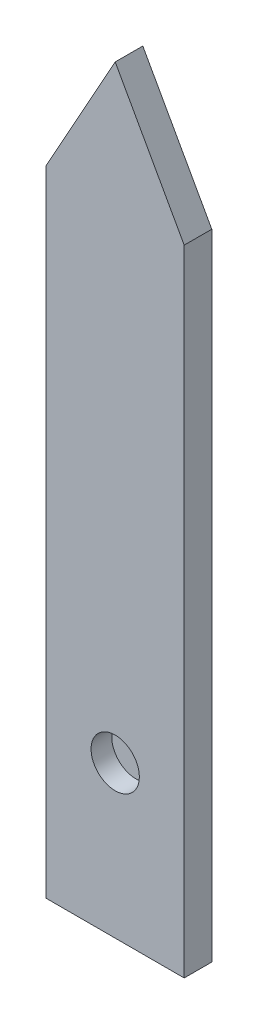
ISO-10303-21;
HEADER;
FILE_DESCRIPTION(('STEP AP214'),'2;1');
FILE_NAME('part.step','',(''),(''),'','','');
FILE_SCHEMA(('AUTOMOTIVE_DESIGN { 1 0 10303 214 1 1 1 1 }'));
ENDSEC;
DATA;
#1=APPLICATION_CONTEXT('core data for automotive mechanical design processes');
#2=APPLICATION_PROTOCOL_DEFINITION('international standard','automotive_design',2000,#1);
#3=PRODUCT_CONTEXT('',#1,'mechanical');
#4=PRODUCT('Part','Part','',(#3));
#5=PRODUCT_RELATED_PRODUCT_CATEGORY('part','',(#4));
#6=PRODUCT_DEFINITION_FORMATION('','',#4);
#7=PRODUCT_DEFINITION_CONTEXT('part definition',#1,'design');
#8=PRODUCT_DEFINITION('design','',#6,#7);
#9=PRODUCT_DEFINITION_SHAPE('','',#8);
#10=(LENGTH_UNIT() NAMED_UNIT(*) SI_UNIT(.MILLI.,.METRE.));
#11=(NAMED_UNIT(*) PLANE_ANGLE_UNIT() SI_UNIT($,.RADIAN.));
#12=(NAMED_UNIT(*) SI_UNIT($,.STERADIAN.) SOLID_ANGLE_UNIT());
#13=UNCERTAINTY_MEASURE_WITH_UNIT(LENGTH_MEASURE(1.E-05),#10,'distance_accuracy_value','');
#14=(GEOMETRIC_REPRESENTATION_CONTEXT(3) GLOBAL_UNCERTAINTY_ASSIGNED_CONTEXT((#13)) GLOBAL_UNIT_ASSIGNED_CONTEXT((#10,
#11,#12)) REPRESENTATION_CONTEXT('',''));
#15=CARTESIAN_POINT('',(0.,0.,0.));
#16=DIRECTION('',(0.,0.,1.));
#17=DIRECTION('',(1.,0.,0.));
#18=AXIS2_PLACEMENT_3D('',#15,#16,#17);
#19=CARTESIAN_POINT('',(0.,92.,4.));
#20=DIRECTION('',(1.,0.,0.));
#21=DIRECTION('',(0.,1.,0.));
#22=AXIS2_PLACEMENT_3D('',#19,#20,#21);
#23=PLANE('',#22);
#24=DIRECTION('',(0.,-1.,0.));
#25=VECTOR('',#24,1.);
#26=CARTESIAN_POINT('',(0.,92.,0.));
#27=LINE('',#26,#25);
#28=CARTESIAN_POINT('',(0.,92.,0.));
#29=VERTEX_POINT('',#28);
#30=CARTESIAN_POINT('',(0.,0.,0.));
#31=VERTEX_POINT('',#30);
#32=EDGE_CURVE('E110',#29,#31,#27,.T.);
#33=ORIENTED_EDGE('',*,*,#32,.T.);
#34=DIRECTION('',(0.,0.,-1.));
#35=VECTOR('',#34,1.);
#36=CARTESIAN_POINT('',(0.,0.,4.));
#37=LINE('',#36,#35);
#38=CARTESIAN_POINT('',(0.,0.,4.));
#39=VERTEX_POINT('',#38);
#40=EDGE_CURVE('E11',#39,#31,#37,.T.);
#41=ORIENTED_EDGE('',*,*,#40,.F.);
#42=DIRECTION('',(0.,-1.,0.));
#43=VECTOR('',#42,1.);
#44=CARTESIAN_POINT('',(0.,92.,4.));
#45=LINE('',#44,#43);
#46=CARTESIAN_POINT('',(0.,92.,4.));
#47=VERTEX_POINT('',#46);
#48=EDGE_CURVE('E119',#47,#39,#45,.T.);
#49=ORIENTED_EDGE('',*,*,#48,.F.);
#50=DIRECTION('',(0.,0.,-1.));
#51=VECTOR('',#50,1.);
#52=CARTESIAN_POINT('',(0.,92.,4.));
#53=LINE('',#52,#51);
#54=EDGE_CURVE('E106',#47,#29,#53,.T.);
#55=ORIENTED_EDGE('',*,*,#54,.T.);
#56=EDGE_LOOP('',(#33,#41,#49,#55));
#57=FACE_BOUND('',#56,.T.);
#58=ADVANCED_FACE('F36',(#57),#23,.F.);
#59=CARTESIAN_POINT('',(0.,0.,4.));
#60=DIRECTION('',(0.,1.,0.));
#61=DIRECTION('',(0.,0.,1.));
#62=AXIS2_PLACEMENT_3D('',#59,#60,#61);
#63=PLANE('',#62);
#64=DIRECTION('',(1.,0.,0.));
#65=VECTOR('',#64,1.);
#66=CARTESIAN_POINT('',(0.,0.,0.));
#67=LINE('',#66,#65);
#68=CARTESIAN_POINT('',(20.,0.,0.));
#69=VERTEX_POINT('',#68);
#70=EDGE_CURVE('E113',#31,#69,#67,.T.);
#71=ORIENTED_EDGE('',*,*,#70,.T.);
#72=DIRECTION('',(0.,0.,-1.));
#73=VECTOR('',#72,1.);
#74=CARTESIAN_POINT('',(20.,0.,4.));
#75=LINE('',#74,#73);
#76=CARTESIAN_POINT('',(20.,0.,4.));
#77=VERTEX_POINT('',#76);
#78=EDGE_CURVE('E44',#77,#69,#75,.T.);
#79=ORIENTED_EDGE('',*,*,#78,.F.);
#80=DIRECTION('',(1.,0.,0.));
#81=VECTOR('',#80,1.);
#82=CARTESIAN_POINT('',(0.,0.,4.));
#83=LINE('',#82,#81);
#84=EDGE_CURVE('E86',#39,#77,#83,.T.);
#85=ORIENTED_EDGE('',*,*,#84,.F.);
#86=ORIENTED_EDGE('',*,*,#40,.T.);
#87=EDGE_LOOP('',(#71,#79,#85,#86));
#88=FACE_BOUND('',#87,.T.);
#89=ADVANCED_FACE('F139',(#88),#63,.F.);
#90=CARTESIAN_POINT('',(20.,0.,4.));
#91=DIRECTION('',(-1.,0.,0.));
#92=DIRECTION('',(0.,0.,1.));
#93=AXIS2_PLACEMENT_3D('',#90,#91,#92);
#94=PLANE('',#93);
#95=DIRECTION('',(0.,1.,0.));
#96=VECTOR('',#95,1.);
#97=CARTESIAN_POINT('',(20.,0.,0.));
#98=LINE('',#97,#96);
#99=CARTESIAN_POINT('',(20.,92.,0.));
#100=VERTEX_POINT('',#99);
#101=EDGE_CURVE('E101',#69,#100,#98,.T.);
#102=ORIENTED_EDGE('',*,*,#101,.T.);
#103=DIRECTION('',(0.,0.,-1.));
#104=VECTOR('',#103,1.);
#105=CARTESIAN_POINT('',(20.,92.,4.));
#106=LINE('',#105,#104);
#107=CARTESIAN_POINT('',(20.,92.,4.));
#108=VERTEX_POINT('',#107);
#109=EDGE_CURVE('E98',#108,#100,#106,.T.);
#110=ORIENTED_EDGE('',*,*,#109,.F.);
#111=DIRECTION('',(0.,1.,0.));
#112=VECTOR('',#111,1.);
#113=CARTESIAN_POINT('',(20.,0.,4.));
#114=LINE('',#113,#112);
#115=EDGE_CURVE('E90',#77,#108,#114,.T.);
#116=ORIENTED_EDGE('',*,*,#115,.F.);
#117=ORIENTED_EDGE('',*,*,#78,.T.);
#118=EDGE_LOOP('',(#102,#110,#116,#117));
#119=FACE_BOUND('',#118,.T.);
#120=ADVANCED_FACE('F99',(#119),#94,.F.);
#121=CARTESIAN_POINT('',(20.,92.,4.));
#122=DIRECTION('',(-0.874157276121538,-0.485642931178632,0.));
#123=DIRECTION('',(0.485642931178632,-0.874157276121538,0.));
#124=AXIS2_PLACEMENT_3D('',#121,#122,#123);
#125=PLANE('',#124);
#126=DIRECTION('',(-0.485642931178632,0.874157276121538,0.));
#127=VECTOR('',#126,1.);
#128=CARTESIAN_POINT('',(20.,92.,0.));
#129=LINE('',#128,#127);
#130=CARTESIAN_POINT('',(9.99999999999999,110.,0.));
#131=VERTEX_POINT('',#130);
#132=EDGE_CURVE('E72',#100,#131,#129,.T.);
#133=ORIENTED_EDGE('',*,*,#132,.T.);
#134=DIRECTION('',(0.,0.,-1.));
#135=VECTOR('',#134,1.);
#136=CARTESIAN_POINT('',(9.99999999999999,110.,4.));
#137=LINE('',#136,#135);
#138=CARTESIAN_POINT('',(9.99999999999999,110.,4.));
#139=VERTEX_POINT('',#138);
#140=EDGE_CURVE('E102',#139,#131,#137,.T.);
#141=ORIENTED_EDGE('',*,*,#140,.F.);
#142=DIRECTION('',(-0.485642931178632,0.874157276121538,0.));
#143=VECTOR('',#142,1.);
#144=CARTESIAN_POINT('',(20.,92.,4.));
#145=LINE('',#144,#143);
#146=EDGE_CURVE('E94',#108,#139,#145,.T.);
#147=ORIENTED_EDGE('',*,*,#146,.F.);
#148=ORIENTED_EDGE('',*,*,#109,.T.);
#149=EDGE_LOOP('',(#133,#141,#147,#148));
#150=FACE_BOUND('',#149,.T.);
#151=ADVANCED_FACE('F104',(#150),#125,.F.);
#152=CARTESIAN_POINT('',(9.99999999999999,110.,4.));
#153=DIRECTION('',(0.874157276121538,-0.485642931178632,0.));
#154=DIRECTION('',(0.485642931178632,0.874157276121538,0.));
#155=AXIS2_PLACEMENT_3D('',#152,#153,#154);
#156=PLANE('',#155);
#157=DIRECTION('',(-0.485642931178632,-0.874157276121538,0.));
#158=VECTOR('',#157,1.);
#159=CARTESIAN_POINT('',(9.99999999999999,110.,0.));
#160=LINE('',#159,#158);
#161=EDGE_CURVE('E78',#131,#29,#160,.T.);
#162=ORIENTED_EDGE('',*,*,#161,.T.);
#163=ORIENTED_EDGE('',*,*,#54,.F.);
#164=DIRECTION('',(-0.485642931178632,-0.874157276121538,0.));
#165=VECTOR('',#164,1.);
#166=CARTESIAN_POINT('',(9.99999999999999,110.,4.));
#167=LINE('',#166,#165);
#168=EDGE_CURVE('E52',#139,#47,#167,.T.);
#169=ORIENTED_EDGE('',*,*,#168,.F.);
#170=ORIENTED_EDGE('',*,*,#140,.T.);
#171=EDGE_LOOP('',(#162,#163,#169,#170));
#172=FACE_BOUND('',#171,.T.);
#173=ADVANCED_FACE('F127',(#172),#156,.F.);
#174=CARTESIAN_POINT('',(0.,0.,4.));
#175=DIRECTION('',(0.,0.,1.));
#176=DIRECTION('',(1.,0.,0.));
#177=AXIS2_PLACEMENT_3D('',#174,#175,#176);
#178=PLANE('',#177);
#179=CARTESIAN_POINT('',(10.,22.,4.));
#180=DIRECTION('',(0.,0.,1.));
#181=DIRECTION('',(1.,0.,0.));
#182=AXIS2_PLACEMENT_3D('',#179,#180,#181);
#183=CIRCLE('',#182,3.5);
#184=CARTESIAN_POINT('',(13.5,22.,4.));
#185=VERTEX_POINT('',#184);
#186=EDGE_CURVE('E196',#185,#185,#183,.T.);
#187=ORIENTED_EDGE('',*,*,#186,.F.);
#188=EDGE_LOOP('',(#187));
#189=FACE_BOUND('',#188,.T.);
#190=ORIENTED_EDGE('',*,*,#48,.T.);
#191=ORIENTED_EDGE('',*,*,#84,.T.);
#192=ORIENTED_EDGE('',*,*,#115,.T.);
#193=ORIENTED_EDGE('',*,*,#146,.T.);
#194=ORIENTED_EDGE('',*,*,#168,.T.);
#195=EDGE_LOOP('',(#190,#191,#192,#193,#194));
#196=FACE_BOUND('',#195,.T.);
#197=ADVANCED_FACE('F92',(#189,#196),#178,.T.);
#198=CARTESIAN_POINT('',(0.,0.,0.));
#199=DIRECTION('',(0.,0.,1.));
#200=DIRECTION('',(1.,0.,0.));
#201=AXIS2_PLACEMENT_3D('',#198,#199,#200);
#202=PLANE('',#201);
#203=ORIENTED_EDGE('',*,*,#32,.F.);
#204=ORIENTED_EDGE('',*,*,#161,.F.);
#205=ORIENTED_EDGE('',*,*,#132,.F.);
#206=ORIENTED_EDGE('',*,*,#101,.F.);
#207=ORIENTED_EDGE('',*,*,#70,.F.);
#208=EDGE_LOOP('',(#203,#204,#205,#206,#207));
#209=FACE_BOUND('',#208,.T.);
#210=ADVANCED_FACE('F123',(#209),#202,.F.);
#211=CARTESIAN_POINT('',(10.,22.,1.));
#212=DIRECTION('',(0.,0.,1.));
#213=DIRECTION('',(1.,0.,0.));
#214=AXIS2_PLACEMENT_3D('',#211,#212,#213);
#215=CYLINDRICAL_SURFACE('',#214,3.5);
#216=CARTESIAN_POINT('',(10.,22.,1.));
#217=DIRECTION('',(0.,0.,1.));
#218=DIRECTION('',(1.,0.,0.));
#219=AXIS2_PLACEMENT_3D('',#216,#217,#218);
#220=CIRCLE('',#219,3.5);
#221=CARTESIAN_POINT('',(13.5,22.,1.));
#222=VERTEX_POINT('',#221);
#223=EDGE_CURVE('E114',#222,#222,#220,.T.);
#224=ORIENTED_EDGE('',*,*,#223,.F.);
#225=EDGE_LOOP('',(#224));
#226=FACE_BOUND('',#225,.T.);
#227=ORIENTED_EDGE('',*,*,#186,.T.);
#228=EDGE_LOOP('',(#227));
#229=FACE_BOUND('',#228,.T.);
#230=ADVANCED_FACE('F167',(#226,#229),#215,.F.);
#231=CARTESIAN_POINT('',(10.,22.,1.));
#232=DIRECTION('',(0.,0.,1.));
#233=DIRECTION('',(1.,0.,0.));
#234=AXIS2_PLACEMENT_3D('',#231,#232,#233);
#235=PLANE('',#234);
#236=ORIENTED_EDGE('',*,*,#223,.T.);
#237=EDGE_LOOP('',(#236));
#238=FACE_BOUND('',#237,.T.);
#239=ADVANCED_FACE('F180',(#238),#235,.T.);
#240=CLOSED_SHELL('',(#58,#89,#120,#151,#173,#197,#210,#230,#239));
#241=MANIFOLD_SOLID_BREP('B2',#240);
#242=ADVANCED_BREP_SHAPE_REPRESENTATION('',(#18,#241),#14);
#243=SHAPE_DEFINITION_REPRESENTATION(#9,#242);
ENDSEC;
END-ISO-10303-21;
